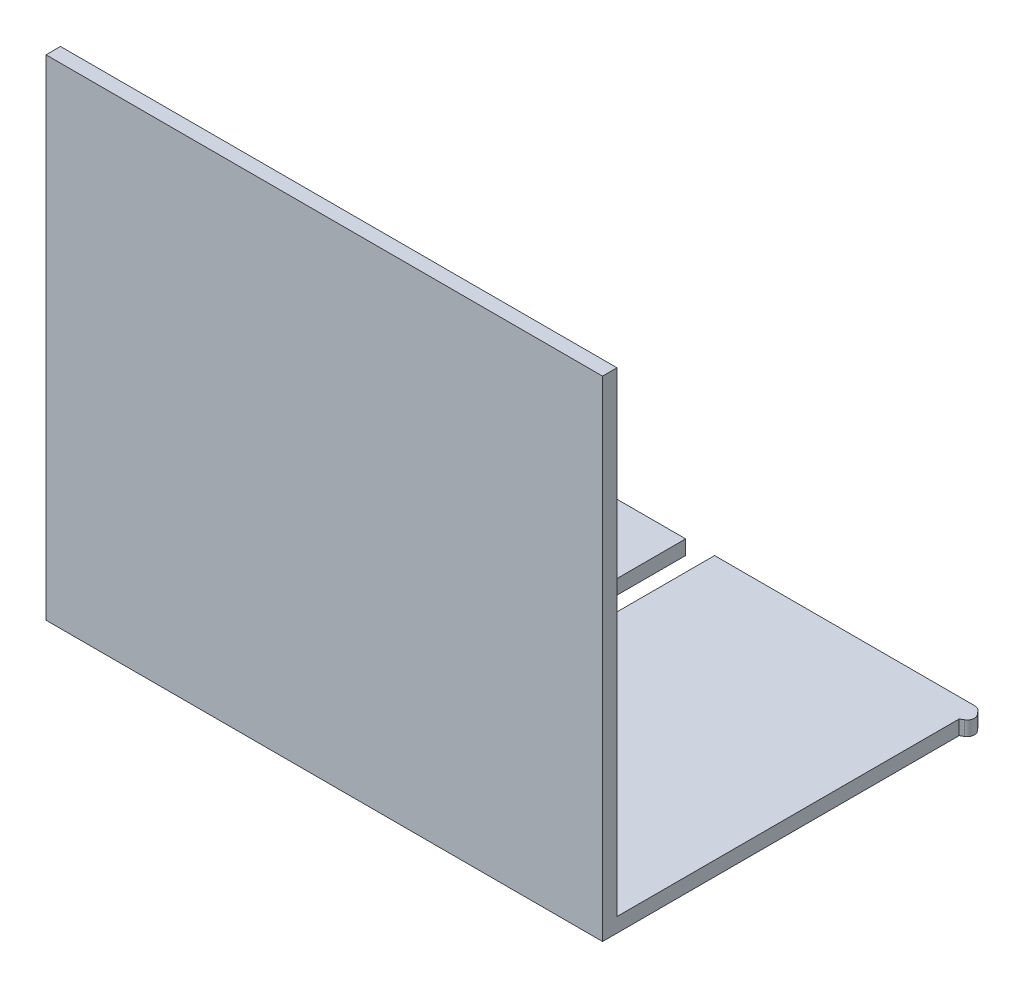
ISO-10303-21;
HEADER;
FILE_DESCRIPTION(('STEP AP214'),'2;1');
FILE_NAME('part.step','',(''),(''),'','','');
FILE_SCHEMA(('AUTOMOTIVE_DESIGN { 1 0 10303 214 1 1 1 1 }'));
ENDSEC;
DATA;
#1=APPLICATION_CONTEXT('core data for automotive mechanical design processes');
#2=APPLICATION_PROTOCOL_DEFINITION('international standard','automotive_design',2000,#1);
#3=PRODUCT_CONTEXT('',#1,'mechanical');
#4=PRODUCT('Part','Part','',(#3));
#5=PRODUCT_RELATED_PRODUCT_CATEGORY('part','',(#4));
#6=PRODUCT_DEFINITION_FORMATION('','',#4);
#7=PRODUCT_DEFINITION_CONTEXT('part definition',#1,'design');
#8=PRODUCT_DEFINITION('design','',#6,#7);
#9=PRODUCT_DEFINITION_SHAPE('','',#8);
#10=(LENGTH_UNIT() NAMED_UNIT(*) SI_UNIT(.MILLI.,.METRE.));
#11=(NAMED_UNIT(*) PLANE_ANGLE_UNIT() SI_UNIT($,.RADIAN.));
#12=(NAMED_UNIT(*) SI_UNIT($,.STERADIAN.) SOLID_ANGLE_UNIT());
#13=UNCERTAINTY_MEASURE_WITH_UNIT(LENGTH_MEASURE(1.E-05),#10,'distance_accuracy_value','');
#14=(GEOMETRIC_REPRESENTATION_CONTEXT(3) GLOBAL_UNCERTAINTY_ASSIGNED_CONTEXT((#13)) GLOBAL_UNIT_ASSIGNED_CONTEXT((#10,
#11,#12)) REPRESENTATION_CONTEXT('',''));
#15=CARTESIAN_POINT('',(0.,0.,0.));
#16=DIRECTION('',(0.,0.,1.));
#17=DIRECTION('',(1.,0.,0.));
#18=AXIS2_PLACEMENT_3D('',#15,#16,#17);
#19=CARTESIAN_POINT('',(-38.5,2.,-25.));
#20=DIRECTION('',(1.,0.,0.));
#21=DIRECTION('',(0.,0.,-1.));
#22=AXIS2_PLACEMENT_3D('',#19,#20,#21);
#23=PLANE('',#22);
#24=DIRECTION('',(0.,1.,0.));
#25=VECTOR('',#24,1.);
#26=CARTESIAN_POINT('',(-38.5,-3.04826000629896,-22.3463442073242));
#27=LINE('',#26,#25);
#28=CARTESIAN_POINT('',(-38.5,0.,-22.3463442073242));
#29=VERTEX_POINT('',#28);
#30=CARTESIAN_POINT('',(-38.5,2.,-22.3463442073242));
#31=VERTEX_POINT('',#30);
#32=EDGE_CURVE('E241',#29,#31,#27,.T.);
#33=ORIENTED_EDGE('',*,*,#32,.F.);
#34=DIRECTION('',(0.,0.,1.));
#35=VECTOR('',#34,1.);
#36=CARTESIAN_POINT('',(-38.5,0.,-25.));
#37=LINE('',#36,#35);
#38=CARTESIAN_POINT('',(-38.5,0.,27.));
#39=VERTEX_POINT('',#38);
#40=EDGE_CURVE('E198',#29,#39,#37,.T.);
#41=ORIENTED_EDGE('',*,*,#40,.T.);
#42=DIRECTION('',(0.,-1.,0.));
#43=VECTOR('',#42,1.);
#44=CARTESIAN_POINT('',(-38.5,67.75,27.));
#45=LINE('',#44,#43);
#46=CARTESIAN_POINT('',(-38.5,67.75,27.));
#47=VERTEX_POINT('',#46);
#48=EDGE_CURVE('E292',#47,#39,#45,.T.);
#49=ORIENTED_EDGE('',*,*,#48,.F.);
#50=DIRECTION('',(0.,0.,-1.));
#51=VECTOR('',#50,1.);
#52=CARTESIAN_POINT('',(-38.5,67.75,25.));
#53=LINE('',#52,#51);
#54=CARTESIAN_POINT('',(-38.5,67.75,25.));
#55=VERTEX_POINT('',#54);
#56=EDGE_CURVE('E283',#47,#55,#53,.T.);
#57=ORIENTED_EDGE('',*,*,#56,.T.);
#58=DIRECTION('',(0.,-1.,0.));
#59=VECTOR('',#58,1.);
#60=CARTESIAN_POINT('',(-38.5,67.75,25.));
#61=LINE('',#60,#59);
#62=CARTESIAN_POINT('',(-38.5,2.,25.));
#63=VERTEX_POINT('',#62);
#64=EDGE_CURVE('E192',#55,#63,#61,.T.);
#65=ORIENTED_EDGE('',*,*,#64,.T.);
#66=DIRECTION('',(0.,0.,1.));
#67=VECTOR('',#66,1.);
#68=CARTESIAN_POINT('',(-38.5,2.,-25.));
#69=LINE('',#68,#67);
#70=EDGE_CURVE('E299',#31,#63,#69,.T.);
#71=ORIENTED_EDGE('',*,*,#70,.F.);
#72=EDGE_LOOP('',(#33,#41,#49,#57,#65,#71));
#73=FACE_BOUND('',#72,.T.);
#74=ADVANCED_FACE('F35',(#73),#23,.F.);
#75=CARTESIAN_POINT('',(-38.5,2.,-25.));
#76=DIRECTION('',(0.,0.,1.));
#77=DIRECTION('',(1.,0.,0.));
#78=AXIS2_PLACEMENT_3D('',#75,#76,#77);
#79=PLANE('',#78);
#80=DIRECTION('',(-1.,0.,0.));
#81=VECTOR('',#80,1.);
#82=CARTESIAN_POINT('',(-38.5,2.,-25.));
#83=LINE('',#82,#81);
#84=CARTESIAN_POINT('',(38.033692341845,2.,-25.));
#85=VERTEX_POINT('',#84);
#86=CARTESIAN_POINT('',(1.99999999999999,2.,-25.));
#87=VERTEX_POINT('',#86);
#88=EDGE_CURVE('E298',#85,#87,#83,.T.);
#89=ORIENTED_EDGE('',*,*,#88,.F.);
#90=DIRECTION('',(0.,-1.,0.));
#91=VECTOR('',#90,1.);
#92=CARTESIAN_POINT('',(38.033692341845,0.,-25.));
#93=LINE('',#92,#91);
#94=CARTESIAN_POINT('',(38.033692341845,0.,-25.));
#95=VERTEX_POINT('',#94);
#96=EDGE_CURVE('E201',#85,#95,#93,.T.);
#97=ORIENTED_EDGE('',*,*,#96,.T.);
#98=DIRECTION('',(-1.,0.,0.));
#99=VECTOR('',#98,1.);
#100=CARTESIAN_POINT('',(-38.5,0.,-25.));
#101=LINE('',#100,#99);
#102=CARTESIAN_POINT('',(1.99999999999999,0.,-25.));
#103=VERTEX_POINT('',#102);
#104=EDGE_CURVE('E190',#95,#103,#101,.T.);
#105=ORIENTED_EDGE('',*,*,#104,.T.);
#106=DIRECTION('',(0.,1.,0.));
#107=VECTOR('',#106,1.);
#108=CARTESIAN_POINT('',(1.99999999999999,0.,-25.));
#109=LINE('',#108,#107);
#110=EDGE_CURVE('E269',#103,#87,#109,.T.);
#111=ORIENTED_EDGE('',*,*,#110,.T.);
#112=EDGE_LOOP('',(#89,#97,#105,#111));
#113=FACE_BOUND('',#112,.T.);
#114=ADVANCED_FACE('F350',(#113),#79,.F.);
#115=CARTESIAN_POINT('',(38.5,2.,-25.));
#116=DIRECTION('',(-1.,0.,0.));
#117=DIRECTION('',(0.,0.,1.));
#118=AXIS2_PLACEMENT_3D('',#115,#116,#117);
#119=PLANE('',#118);
#120=DIRECTION('',(0.,0.,-1.));
#121=VECTOR('',#120,1.);
#122=CARTESIAN_POINT('',(38.5,0.,-25.));
#123=LINE('',#122,#121);
#124=CARTESIAN_POINT('',(38.5,0.,27.));
#125=VERTEX_POINT('',#124);
#126=CARTESIAN_POINT('',(38.5,0.,-22.3463442073242));
#127=VERTEX_POINT('',#126);
#128=EDGE_CURVE('E165',#125,#127,#123,.T.);
#129=ORIENTED_EDGE('',*,*,#128,.T.);
#130=DIRECTION('',(0.,1.,0.));
#131=VECTOR('',#130,1.);
#132=CARTESIAN_POINT('',(38.5,-3.04826000629896,-22.3463442073242));
#133=LINE('',#132,#131);
#134=CARTESIAN_POINT('',(38.5,2.,-22.3463442073242));
#135=VERTEX_POINT('',#134);
#136=EDGE_CURVE('E172',#127,#135,#133,.T.);
#137=ORIENTED_EDGE('',*,*,#136,.T.);
#138=DIRECTION('',(0.,0.,-1.));
#139=VECTOR('',#138,1.);
#140=CARTESIAN_POINT('',(38.5,2.,-25.));
#141=LINE('',#140,#139);
#142=CARTESIAN_POINT('',(38.5,2.,25.));
#143=VERTEX_POINT('',#142);
#144=EDGE_CURVE('E200',#143,#135,#141,.T.);
#145=ORIENTED_EDGE('',*,*,#144,.F.);
#146=DIRECTION('',(0.,-1.,0.));
#147=VECTOR('',#146,1.);
#148=CARTESIAN_POINT('',(38.5,67.75,25.));
#149=LINE('',#148,#147);
#150=CARTESIAN_POINT('',(38.5,67.75,25.));
#151=VERTEX_POINT('',#150);
#152=EDGE_CURVE('E187',#151,#143,#149,.T.);
#153=ORIENTED_EDGE('',*,*,#152,.F.);
#154=DIRECTION('',(0.,0.,1.));
#155=VECTOR('',#154,1.);
#156=CARTESIAN_POINT('',(38.5,67.75,25.));
#157=LINE('',#156,#155);
#158=CARTESIAN_POINT('',(38.5,67.75,27.));
#159=VERTEX_POINT('',#158);
#160=EDGE_CURVE('E278',#151,#159,#157,.T.);
#161=ORIENTED_EDGE('',*,*,#160,.T.);
#162=DIRECTION('',(0.,-1.,0.));
#163=VECTOR('',#162,1.);
#164=CARTESIAN_POINT('',(38.5,67.75,27.));
#165=LINE('',#164,#163);
#166=EDGE_CURVE('E184',#159,#125,#165,.T.);
#167=ORIENTED_EDGE('',*,*,#166,.T.);
#168=EDGE_LOOP('',(#129,#137,#145,#153,#161,#167));
#169=FACE_BOUND('',#168,.T.);
#170=ADVANCED_FACE('F182',(#169),#119,.F.);
#171=CARTESIAN_POINT('',(-2.,0.,-25.));
#172=VERTEX_POINT('',#171);
#173=CARTESIAN_POINT('',(-38.033692341845,0.,-25.));
#174=VERTEX_POINT('',#173);
#175=EDGE_CURVE('E186',#172,#174,#101,.T.);
#176=ORIENTED_EDGE('',*,*,#175,.T.);
#177=DIRECTION('',(0.,-1.,0.));
#178=VECTOR('',#177,1.);
#179=CARTESIAN_POINT('',(-38.033692341845,2.,-25.));
#180=LINE('',#179,#178);
#181=CARTESIAN_POINT('',(-38.033692341845,2.,-25.));
#182=VERTEX_POINT('',#181);
#183=EDGE_CURVE('E227',#174,#182,#180,.F.);
#184=ORIENTED_EDGE('',*,*,#183,.T.);
#185=CARTESIAN_POINT('',(-2.,2.,-25.));
#186=VERTEX_POINT('',#185);
#187=EDGE_CURVE('E297',#186,#182,#83,.T.);
#188=ORIENTED_EDGE('',*,*,#187,.F.);
#189=DIRECTION('',(0.,1.,0.));
#190=VECTOR('',#189,1.);
#191=CARTESIAN_POINT('',(-2.,0.,-25.));
#192=LINE('',#191,#190);
#193=EDGE_CURVE('E261',#172,#186,#192,.T.);
#194=ORIENTED_EDGE('',*,*,#193,.F.);
#195=EDGE_LOOP('',(#176,#184,#188,#194));
#196=FACE_BOUND('',#195,.T.);
#197=ADVANCED_FACE('F333',(#196),#79,.F.);
#198=CARTESIAN_POINT('',(0.,2.,0.));
#199=DIRECTION('',(0.,1.,0.));
#200=DIRECTION('',(0.,0.,1.));
#201=AXIS2_PLACEMENT_3D('',#198,#199,#200);
#202=PLANE('',#201);
#203=DIRECTION('',(-0.642787609686533,0.,-0.766044443118983));
#204=VECTOR('',#203,1.);
#205=CARTESIAN_POINT('',(38.5,2.,-25.));
#206=LINE('',#205,#204);
#207=CARTESIAN_POINT('',(39.233955556881,2.,-24.1253058282825));
#208=VERTEX_POINT('',#207);
#209=CARTESIAN_POINT('',(38.799736784964,2.,-24.6427876096865));
#210=VERTEX_POINT('',#209);
#211=EDGE_CURVE('E232',#208,#210,#206,.T.);
#212=ORIENTED_EDGE('',*,*,#211,.T.);
#213=CARTESIAN_POINT('',(38.033692341845,2.,-24.));
#214=DIRECTION('',(0.,1.,0.));
#215=DIRECTION('',(0.,0.,1.));
#216=AXIS2_PLACEMENT_3D('',#213,#214,#215);
#217=CIRCLE('',#216,1.);
#218=EDGE_CURVE('E219',#210,#85,#217,.T.);
#219=ORIENTED_EDGE('',*,*,#218,.T.);
#220=ORIENTED_EDGE('',*,*,#88,.T.);
#221=DIRECTION('',(0.,0.,-1.));
#222=VECTOR('',#221,1.);
#223=CARTESIAN_POINT('',(1.99999999999999,2.,-25.));
#224=LINE('',#223,#222);
#225=CARTESIAN_POINT('',(2.,2.,15.));
#226=VERTEX_POINT('',#225);
#227=EDGE_CURVE('E255',#226,#87,#224,.T.);
#228=ORIENTED_EDGE('',*,*,#227,.F.);
#229=CARTESIAN_POINT('',(0.,2.,15.));
#230=DIRECTION('',(0.,1.,0.));
#231=DIRECTION('',(0.,0.,-1.));
#232=AXIS2_PLACEMENT_3D('',#229,#230,#231);
#233=CIRCLE('',#232,2.);
#234=CARTESIAN_POINT('',(-2.,2.,15.));
#235=VERTEX_POINT('',#234);
#236=EDGE_CURVE('E264',#235,#226,#233,.T.);
#237=ORIENTED_EDGE('',*,*,#236,.F.);
#238=DIRECTION('',(0.,0.,1.));
#239=VECTOR('',#238,1.);
#240=CARTESIAN_POINT('',(-2.,2.,15.));
#241=LINE('',#240,#239);
#242=EDGE_CURVE('E250',#186,#235,#241,.T.);
#243=ORIENTED_EDGE('',*,*,#242,.F.);
#244=ORIENTED_EDGE('',*,*,#187,.T.);
#245=CARTESIAN_POINT('',(-38.033692341845,2.,-24.));
#246=DIRECTION('',(0.,1.,0.));
#247=DIRECTION('',(0.,0.,1.));
#248=AXIS2_PLACEMENT_3D('',#245,#246,#247);
#249=CIRCLE('',#248,1.);
#250=CARTESIAN_POINT('',(-38.799736784964,2.,-24.6427876096865));
#251=VERTEX_POINT('',#250);
#252=EDGE_CURVE('E217',#182,#251,#249,.T.);
#253=ORIENTED_EDGE('',*,*,#252,.T.);
#254=DIRECTION('',(-0.642787609686533,0.,0.766044443118983));
#255=VECTOR('',#254,1.);
#256=CARTESIAN_POINT('',(-38.5,2.,-25.));
#257=LINE('',#256,#255);
#258=CARTESIAN_POINT('',(-39.233955556881,2.,-24.1253058282825));
#259=VERTEX_POINT('',#258);
#260=EDGE_CURVE('E242',#251,#259,#257,.T.);
#261=ORIENTED_EDGE('',*,*,#260,.T.);
#262=CARTESIAN_POINT('',(-38.467911113762,2.,-23.482518218596));
#263=DIRECTION('',(0.,1.,0.));
#264=DIRECTION('',(0.,0.,1.));
#265=AXIS2_PLACEMENT_3D('',#262,#263,#264);
#266=CIRCLE('',#265,1.);
#267=CARTESIAN_POINT('',(-38.9679111137621,2.,-22.6164928148116));
#268=VERTEX_POINT('',#267);
#269=EDGE_CURVE('E58',#259,#268,#266,.T.);
#270=ORIENTED_EDGE('',*,*,#269,.T.);
#271=DIRECTION('',(0.866025403784434,0.,0.500000000000008));
#272=VECTOR('',#271,1.);
#273=CARTESIAN_POINT('',(-40.,2.,-23.2123696111087));
#274=LINE('',#273,#272);
#275=EDGE_CURVE('E244',#268,#31,#274,.T.);
#276=ORIENTED_EDGE('',*,*,#275,.T.);
#277=ORIENTED_EDGE('',*,*,#70,.T.);
#278=DIRECTION('',(1.,0.,0.));
#279=VECTOR('',#278,1.);
#280=CARTESIAN_POINT('',(-38.5,2.,25.));
#281=LINE('',#280,#279);
#282=EDGE_CURVE('E195',#63,#143,#281,.T.);
#283=ORIENTED_EDGE('',*,*,#282,.T.);
#284=ORIENTED_EDGE('',*,*,#144,.T.);
#285=DIRECTION('',(0.866025403784435,0.,-0.500000000000006));
#286=VECTOR('',#285,1.);
#287=CARTESIAN_POINT('',(40.,2.,-23.2123696111087));
#288=LINE('',#287,#286);
#289=CARTESIAN_POINT('',(38.9679111137621,2.,-22.6164928148116));
#290=VERTEX_POINT('',#289);
#291=EDGE_CURVE('E177',#135,#290,#288,.T.);
#292=ORIENTED_EDGE('',*,*,#291,.T.);
#293=CARTESIAN_POINT('',(38.467911113762,2.,-23.482518218596));
#294=DIRECTION('',(0.,1.,0.));
#295=DIRECTION('',(0.,0.,1.));
#296=AXIS2_PLACEMENT_3D('',#293,#294,#295);
#297=CIRCLE('',#296,1.);
#298=EDGE_CURVE('E50',#290,#208,#297,.T.);
#299=ORIENTED_EDGE('',*,*,#298,.T.);
#300=EDGE_LOOP('',(#212,#219,#220,#228,#237,#243,#244,#253,#261,#270,#276,#277,#283,#284,#292,#299));
#301=FACE_BOUND('',#300,.T.);
#302=ADVANCED_FACE('F229',(#301),#202,.T.);
#303=CARTESIAN_POINT('',(0.,0.,0.));
#304=DIRECTION('',(0.,1.,0.));
#305=DIRECTION('',(0.,0.,1.));
#306=AXIS2_PLACEMENT_3D('',#303,#304,#305);
#307=PLANE('',#306);
#308=ORIENTED_EDGE('',*,*,#104,.F.);
#309=CARTESIAN_POINT('',(38.033692341845,0.,-24.));
#310=DIRECTION('',(0.,1.,0.));
#311=DIRECTION('',(0.,0.,1.));
#312=AXIS2_PLACEMENT_3D('',#309,#310,#311);
#313=CIRCLE('',#312,1.);
#314=CARTESIAN_POINT('',(38.799736784964,0.,-24.6427876096865));
#315=VERTEX_POINT('',#314);
#316=EDGE_CURVE('E209',#95,#315,#313,.F.);
#317=ORIENTED_EDGE('',*,*,#316,.T.);
#318=DIRECTION('',(0.642787609686533,0.,0.766044443118983));
#319=VECTOR('',#318,1.);
#320=CARTESIAN_POINT('',(38.5,0.,-25.));
#321=LINE('',#320,#319);
#322=CARTESIAN_POINT('',(39.233955556881,0.,-24.1253058282825));
#323=VERTEX_POINT('',#322);
#324=EDGE_CURVE('E171',#315,#323,#321,.T.);
#325=ORIENTED_EDGE('',*,*,#324,.T.);
#326=CARTESIAN_POINT('',(38.467911113762,0.,-23.482518218596));
#327=DIRECTION('',(0.,1.,0.));
#328=DIRECTION('',(0.,0.,1.));
#329=AXIS2_PLACEMENT_3D('',#326,#327,#328);
#330=CIRCLE('',#329,1.);
#331=CARTESIAN_POINT('',(38.9679111137621,0.,-22.6164928148116));
#332=VERTEX_POINT('',#331);
#333=EDGE_CURVE('E169',#323,#332,#330,.F.);
#334=ORIENTED_EDGE('',*,*,#333,.T.);
#335=DIRECTION('',(-0.866025403784435,0.,0.500000000000006));
#336=VECTOR('',#335,1.);
#337=CARTESIAN_POINT('',(40.,0.,-23.2123696111087));
#338=LINE('',#337,#336);
#339=EDGE_CURVE('E159',#332,#127,#338,.T.);
#340=ORIENTED_EDGE('',*,*,#339,.T.);
#341=ORIENTED_EDGE('',*,*,#128,.F.);
#342=DIRECTION('',(-1.,0.,0.));
#343=VECTOR('',#342,1.);
#344=CARTESIAN_POINT('',(38.5,0.,27.));
#345=LINE('',#344,#343);
#346=EDGE_CURVE('E272',#125,#39,#345,.T.);
#347=ORIENTED_EDGE('',*,*,#346,.T.);
#348=ORIENTED_EDGE('',*,*,#40,.F.);
#349=DIRECTION('',(-0.866025403784434,0.,-0.500000000000008));
#350=VECTOR('',#349,1.);
#351=CARTESIAN_POINT('',(-40.,0.,-23.2123696111087));
#352=LINE('',#351,#350);
#353=CARTESIAN_POINT('',(-38.9679111137621,0.,-22.6164928148116));
#354=VERTEX_POINT('',#353);
#355=EDGE_CURVE('E237',#29,#354,#352,.T.);
#356=ORIENTED_EDGE('',*,*,#355,.T.);
#357=CARTESIAN_POINT('',(-38.467911113762,0.,-23.482518218596));
#358=DIRECTION('',(0.,1.,0.));
#359=DIRECTION('',(0.,0.,1.));
#360=AXIS2_PLACEMENT_3D('',#357,#358,#359);
#361=CIRCLE('',#360,1.);
#362=CARTESIAN_POINT('',(-39.233955556881,0.,-24.1253058282825));
#363=VERTEX_POINT('',#362);
#364=EDGE_CURVE('E204',#354,#363,#361,.F.);
#365=ORIENTED_EDGE('',*,*,#364,.T.);
#366=DIRECTION('',(0.642787609686533,0.,-0.766044443118983));
#367=VECTOR('',#366,1.);
#368=CARTESIAN_POINT('',(-38.5,0.,-25.));
#369=LINE('',#368,#367);
#370=CARTESIAN_POINT('',(-38.799736784964,0.,-24.6427876096865));
#371=VERTEX_POINT('',#370);
#372=EDGE_CURVE('E240',#363,#371,#369,.T.);
#373=ORIENTED_EDGE('',*,*,#372,.T.);
#374=CARTESIAN_POINT('',(-38.033692341845,0.,-24.));
#375=DIRECTION('',(0.,1.,0.));
#376=DIRECTION('',(0.,0.,1.));
#377=AXIS2_PLACEMENT_3D('',#374,#375,#376);
#378=CIRCLE('',#377,1.);
#379=EDGE_CURVE('E207',#371,#174,#378,.F.);
#380=ORIENTED_EDGE('',*,*,#379,.T.);
#381=ORIENTED_EDGE('',*,*,#175,.F.);
#382=DIRECTION('',(0.,0.,1.));
#383=VECTOR('',#382,1.);
#384=CARTESIAN_POINT('',(-2.,0.,15.));
#385=LINE('',#384,#383);
#386=CARTESIAN_POINT('',(-2.,0.,15.));
#387=VERTEX_POINT('',#386);
#388=EDGE_CURVE('E251',#172,#387,#385,.T.);
#389=ORIENTED_EDGE('',*,*,#388,.T.);
#390=CARTESIAN_POINT('',(0.,0.,15.));
#391=DIRECTION('',(0.,1.,0.));
#392=DIRECTION('',(0.,0.,-1.));
#393=AXIS2_PLACEMENT_3D('',#390,#391,#392);
#394=CIRCLE('',#393,2.);
#395=CARTESIAN_POINT('',(2.,0.,15.));
#396=VERTEX_POINT('',#395);
#397=EDGE_CURVE('E254',#387,#396,#394,.T.);
#398=ORIENTED_EDGE('',*,*,#397,.T.);
#399=DIRECTION('',(0.,0.,-1.));
#400=VECTOR('',#399,1.);
#401=CARTESIAN_POINT('',(1.99999999999999,0.,-25.));
#402=LINE('',#401,#400);
#403=EDGE_CURVE('E258',#396,#103,#402,.T.);
#404=ORIENTED_EDGE('',*,*,#403,.T.);
#405=EDGE_LOOP('',(#308,#317,#325,#334,#340,#341,#347,#348,#356,#365,#373,#380,#381,#389,#398,#404));
#406=FACE_BOUND('',#405,.T.);
#407=ADVANCED_FACE('F162',(#406),#307,.F.);
#408=CARTESIAN_POINT('',(38.5,67.75,25.));
#409=DIRECTION('',(0.,0.,-1.));
#410=DIRECTION('',(-1.,0.,0.));
#411=AXIS2_PLACEMENT_3D('',#408,#409,#410);
#412=PLANE('',#411);
#413=ORIENTED_EDGE('',*,*,#282,.F.);
#414=ORIENTED_EDGE('',*,*,#64,.F.);
#415=DIRECTION('',(1.,0.,0.));
#416=VECTOR('',#415,1.);
#417=CARTESIAN_POINT('',(38.5,67.75,25.));
#418=LINE('',#417,#416);
#419=EDGE_CURVE('E286',#55,#151,#418,.T.);
#420=ORIENTED_EDGE('',*,*,#419,.T.);
#421=ORIENTED_EDGE('',*,*,#152,.T.);
#422=EDGE_LOOP('',(#413,#414,#420,#421));
#423=FACE_BOUND('',#422,.T.);
#424=ADVANCED_FACE('F309',(#423),#412,.T.);
#425=CARTESIAN_POINT('',(38.5,67.75,27.));
#426=DIRECTION('',(0.,0.,1.));
#427=DIRECTION('',(1.,0.,0.));
#428=AXIS2_PLACEMENT_3D('',#425,#426,#427);
#429=PLANE('',#428);
#430=ORIENTED_EDGE('',*,*,#346,.F.);
#431=ORIENTED_EDGE('',*,*,#166,.F.);
#432=DIRECTION('',(-1.,0.,0.));
#433=VECTOR('',#432,1.);
#434=CARTESIAN_POINT('',(38.5,67.75,27.));
#435=LINE('',#434,#433);
#436=EDGE_CURVE('E280',#159,#47,#435,.T.);
#437=ORIENTED_EDGE('',*,*,#436,.T.);
#438=ORIENTED_EDGE('',*,*,#48,.T.);
#439=EDGE_LOOP('',(#430,#431,#437,#438));
#440=FACE_BOUND('',#439,.T.);
#441=ADVANCED_FACE('F312',(#440),#429,.T.);
#442=CARTESIAN_POINT('',(0.,67.75,0.));
#443=DIRECTION('',(0.,-1.,0.));
#444=DIRECTION('',(0.,0.,-1.));
#445=AXIS2_PLACEMENT_3D('',#442,#443,#444);
#446=PLANE('',#445);
#447=ORIENTED_EDGE('',*,*,#160,.F.);
#448=ORIENTED_EDGE('',*,*,#419,.F.);
#449=ORIENTED_EDGE('',*,*,#56,.F.);
#450=ORIENTED_EDGE('',*,*,#436,.F.);
#451=EDGE_LOOP('',(#447,#448,#449,#450));
#452=FACE_BOUND('',#451,.T.);
#453=ADVANCED_FACE('F307',(#452),#446,.F.);
#454=CARTESIAN_POINT('',(1.99999999999999,0.,-25.));
#455=DIRECTION('',(1.,0.,0.));
#456=DIRECTION('',(0.,0.,-1.));
#457=AXIS2_PLACEMENT_3D('',#454,#455,#456);
#458=PLANE('',#457);
#459=ORIENTED_EDGE('',*,*,#227,.T.);
#460=ORIENTED_EDGE('',*,*,#110,.F.);
#461=ORIENTED_EDGE('',*,*,#403,.F.);
#462=DIRECTION('',(0.,1.,0.));
#463=VECTOR('',#462,1.);
#464=CARTESIAN_POINT('',(2.,0.,15.));
#465=LINE('',#464,#463);
#466=EDGE_CURVE('E273',#396,#226,#465,.T.);
#467=ORIENTED_EDGE('',*,*,#466,.T.);
#468=EDGE_LOOP('',(#459,#460,#461,#467));
#469=FACE_BOUND('',#468,.T.);
#470=ADVANCED_FACE('F347',(#469),#458,.F.);
#471=CARTESIAN_POINT('',(0.,0.,15.));
#472=DIRECTION('',(0.,1.,0.));
#473=DIRECTION('',(0.,0.,1.));
#474=AXIS2_PLACEMENT_3D('',#471,#472,#473);
#475=CYLINDRICAL_SURFACE('',#474,2.);
#476=ORIENTED_EDGE('',*,*,#236,.T.);
#477=ORIENTED_EDGE('',*,*,#466,.F.);
#478=ORIENTED_EDGE('',*,*,#397,.F.);
#479=DIRECTION('',(0.,1.,0.));
#480=VECTOR('',#479,1.);
#481=CARTESIAN_POINT('',(-2.,0.,15.));
#482=LINE('',#481,#480);
#483=EDGE_CURVE('E275',#387,#235,#482,.T.);
#484=ORIENTED_EDGE('',*,*,#483,.T.);
#485=EDGE_LOOP('',(#476,#477,#478,#484));
#486=FACE_BOUND('',#485,.T.);
#487=ADVANCED_FACE('F343',(#486),#475,.F.);
#488=CARTESIAN_POINT('',(-2.,0.,15.));
#489=DIRECTION('',(-1.,0.,0.));
#490=DIRECTION('',(0.,0.,1.));
#491=AXIS2_PLACEMENT_3D('',#488,#489,#490);
#492=PLANE('',#491);
#493=ORIENTED_EDGE('',*,*,#242,.T.);
#494=ORIENTED_EDGE('',*,*,#483,.F.);
#495=ORIENTED_EDGE('',*,*,#388,.F.);
#496=ORIENTED_EDGE('',*,*,#193,.T.);
#497=EDGE_LOOP('',(#493,#494,#495,#496));
#498=FACE_BOUND('',#497,.T.);
#499=ADVANCED_FACE('F338',(#498),#492,.F.);
#500=CARTESIAN_POINT('',(-40.,-3.04826000629896,-23.2123696111087));
#501=DIRECTION('',(-0.500000000000008,0.,0.866025403784434));
#502=DIRECTION('',(0.866025403784434,0.,0.500000000000008));
#503=AXIS2_PLACEMENT_3D('',#500,#501,#502);
#504=PLANE('',#503);
#505=ORIENTED_EDGE('',*,*,#275,.F.);
#506=DIRECTION('',(0.,1.,0.));
#507=VECTOR('',#506,1.);
#508=CARTESIAN_POINT('',(-38.9679111137621,-3.04826000629896,-22.6164928148116));
#509=LINE('',#508,#507);
#510=EDGE_CURVE('E11',#268,#354,#509,.F.);
#511=ORIENTED_EDGE('',*,*,#510,.T.);
#512=ORIENTED_EDGE('',*,*,#355,.F.);
#513=ORIENTED_EDGE('',*,*,#32,.T.);
#514=EDGE_LOOP('',(#505,#511,#512,#513));
#515=FACE_BOUND('',#514,.T.);
#516=ADVANCED_FACE('F317',(#515),#504,.T.);
#517=CARTESIAN_POINT('',(-38.5,-3.04826000629896,-25.));
#518=DIRECTION('',(-0.766044443118983,0.,-0.642787609686533));
#519=DIRECTION('',(-0.642787609686533,0.,0.766044443118983));
#520=AXIS2_PLACEMENT_3D('',#517,#518,#519);
#521=PLANE('',#520);
#522=ORIENTED_EDGE('',*,*,#260,.F.);
#523=DIRECTION('',(0.,-1.,0.));
#524=VECTOR('',#523,1.);
#525=CARTESIAN_POINT('',(-38.799736784964,0.,-24.6427876096865));
#526=LINE('',#525,#524);
#527=EDGE_CURVE('E224',#251,#371,#526,.T.);
#528=ORIENTED_EDGE('',*,*,#527,.T.);
#529=ORIENTED_EDGE('',*,*,#372,.F.);
#530=DIRECTION('',(0.,1.,0.));
#531=VECTOR('',#530,1.);
#532=CARTESIAN_POINT('',(-39.233955556881,-3.04826000629896,-24.1253058282825));
#533=LINE('',#532,#531);
#534=EDGE_CURVE('E221',#363,#259,#533,.T.);
#535=ORIENTED_EDGE('',*,*,#534,.T.);
#536=EDGE_LOOP('',(#522,#528,#529,#535));
#537=FACE_BOUND('',#536,.T.);
#538=ADVANCED_FACE('F324',(#537),#521,.T.);
#539=CARTESIAN_POINT('',(38.5,-3.04826000629896,-25.));
#540=DIRECTION('',(0.766044443118983,0.,-0.642787609686533));
#541=DIRECTION('',(-0.642787609686533,0.,-0.766044443118983));
#542=AXIS2_PLACEMENT_3D('',#539,#540,#541);
#543=PLANE('',#542);
#544=ORIENTED_EDGE('',*,*,#324,.F.);
#545=DIRECTION('',(0.,-1.,0.));
#546=VECTOR('',#545,1.);
#547=CARTESIAN_POINT('',(38.799736784964,2.,-24.6427876096865));
#548=LINE('',#547,#546);
#549=EDGE_CURVE('E213',#315,#210,#548,.F.);
#550=ORIENTED_EDGE('',*,*,#549,.T.);
#551=ORIENTED_EDGE('',*,*,#211,.F.);
#552=DIRECTION('',(0.,1.,0.));
#553=VECTOR('',#552,1.);
#554=CARTESIAN_POINT('',(39.233955556881,-3.04826000629896,-24.1253058282825));
#555=LINE('',#554,#553);
#556=EDGE_CURVE('E211',#208,#323,#555,.F.);
#557=ORIENTED_EDGE('',*,*,#556,.T.);
#558=EDGE_LOOP('',(#544,#550,#551,#557));
#559=FACE_BOUND('',#558,.T.);
#560=ADVANCED_FACE('F358',(#559),#543,.T.);
#561=CARTESIAN_POINT('',(40.,-3.04826000629896,-23.2123696111087));
#562=DIRECTION('',(0.500000000000006,0.,0.866025403784435));
#563=DIRECTION('',(0.866025403784435,0.,-0.500000000000006));
#564=AXIS2_PLACEMENT_3D('',#561,#562,#563);
#565=PLANE('',#564);
#566=ORIENTED_EDGE('',*,*,#339,.F.);
#567=DIRECTION('',(0.,1.,0.));
#568=VECTOR('',#567,1.);
#569=CARTESIAN_POINT('',(38.9679111137621,-3.04826000629896,-22.6164928148116));
#570=LINE('',#569,#568);
#571=EDGE_CURVE('E43',#332,#290,#570,.T.);
#572=ORIENTED_EDGE('',*,*,#571,.T.);
#573=ORIENTED_EDGE('',*,*,#291,.F.);
#574=ORIENTED_EDGE('',*,*,#136,.F.);
#575=EDGE_LOOP('',(#566,#572,#573,#574));
#576=FACE_BOUND('',#575,.T.);
#577=ADVANCED_FACE('F175',(#576),#565,.T.);
#578=CARTESIAN_POINT('',(38.033692341845,2.,-24.));
#579=DIRECTION('',(0.,1.,0.));
#580=DIRECTION('',(0.,0.,1.));
#581=AXIS2_PLACEMENT_3D('',#578,#579,#580);
#582=CYLINDRICAL_SURFACE('',#581,1.);
#583=ORIENTED_EDGE('',*,*,#218,.F.);
#584=ORIENTED_EDGE('',*,*,#549,.F.);
#585=ORIENTED_EDGE('',*,*,#316,.F.);
#586=ORIENTED_EDGE('',*,*,#96,.F.);
#587=EDGE_LOOP('',(#583,#584,#585,#586));
#588=FACE_BOUND('',#587,.T.);
#589=ADVANCED_FACE('F354',(#588),#582,.T.);
#590=CARTESIAN_POINT('',(-38.033692341845,-3.04826000629896,-24.));
#591=DIRECTION('',(0.,1.,0.));
#592=DIRECTION('',(0.,0.,1.));
#593=AXIS2_PLACEMENT_3D('',#590,#591,#592);
#594=CYLINDRICAL_SURFACE('',#593,1.);
#595=ORIENTED_EDGE('',*,*,#252,.F.);
#596=ORIENTED_EDGE('',*,*,#183,.F.);
#597=ORIENTED_EDGE('',*,*,#379,.F.);
#598=ORIENTED_EDGE('',*,*,#527,.F.);
#599=EDGE_LOOP('',(#595,#596,#597,#598));
#600=FACE_BOUND('',#599,.T.);
#601=ADVANCED_FACE('F328',(#600),#594,.T.);
#602=CARTESIAN_POINT('',(38.467911113762,-3.04826000629896,-23.482518218596));
#603=DIRECTION('',(0.,1.,0.));
#604=DIRECTION('',(0.,0.,1.));
#605=AXIS2_PLACEMENT_3D('',#602,#603,#604);
#606=CYLINDRICAL_SURFACE('',#605,1.);
#607=ORIENTED_EDGE('',*,*,#333,.F.);
#608=ORIENTED_EDGE('',*,*,#556,.F.);
#609=ORIENTED_EDGE('',*,*,#298,.F.);
#610=ORIENTED_EDGE('',*,*,#571,.F.);
#611=EDGE_LOOP('',(#607,#608,#609,#610));
#612=FACE_BOUND('',#611,.T.);
#613=ADVANCED_FACE('F359',(#612),#606,.T.);
#614=CARTESIAN_POINT('',(-38.467911113762,-3.04826000629896,-23.482518218596));
#615=DIRECTION('',(0.,1.,0.));
#616=DIRECTION('',(0.,0.,1.));
#617=AXIS2_PLACEMENT_3D('',#614,#615,#616);
#618=CYLINDRICAL_SURFACE('',#617,1.);
#619=ORIENTED_EDGE('',*,*,#364,.F.);
#620=ORIENTED_EDGE('',*,*,#510,.F.);
#621=ORIENTED_EDGE('',*,*,#269,.F.);
#622=ORIENTED_EDGE('',*,*,#534,.F.);
#623=EDGE_LOOP('',(#619,#620,#621,#622));
#624=FACE_BOUND('',#623,.T.);
#625=ADVANCED_FACE('F37',(#624),#618,.T.);
#626=CLOSED_SHELL('',(#74,#114,#170,#197,#302,#407,#424,#441,#453,#470,#487,#499,#516,#538,#560,
#577,#589,#601,#613,#625));
#627=MANIFOLD_SOLID_BREP('B2',#626);
#628=ADVANCED_BREP_SHAPE_REPRESENTATION('',(#18,#627),#14);
#629=SHAPE_DEFINITION_REPRESENTATION(#9,#628);
ENDSEC;
END-ISO-10303-21;
